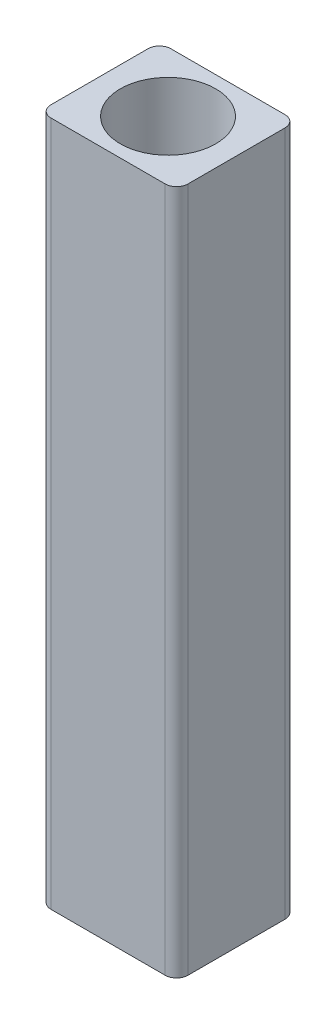
ISO-10303-21;
HEADER;
FILE_DESCRIPTION(('STEP AP214'),'2;1');
FILE_NAME('part.step','',(''),(''),'','','');
FILE_SCHEMA(('AUTOMOTIVE_DESIGN { 1 0 10303 214 1 1 1 1 }'));
ENDSEC;
DATA;
#1=APPLICATION_CONTEXT('core data for automotive mechanical design processes');
#2=APPLICATION_PROTOCOL_DEFINITION('international standard','automotive_design',2000,#1);
#3=PRODUCT_CONTEXT('',#1,'mechanical');
#4=PRODUCT('Part','Part','',(#3));
#5=PRODUCT_RELATED_PRODUCT_CATEGORY('part','',(#4));
#6=PRODUCT_DEFINITION_FORMATION('','',#4);
#7=PRODUCT_DEFINITION_CONTEXT('part definition',#1,'design');
#8=PRODUCT_DEFINITION('design','',#6,#7);
#9=PRODUCT_DEFINITION_SHAPE('','',#8);
#10=(LENGTH_UNIT() NAMED_UNIT(*) SI_UNIT(.MILLI.,.METRE.));
#11=(NAMED_UNIT(*) PLANE_ANGLE_UNIT() SI_UNIT($,.RADIAN.));
#12=(NAMED_UNIT(*) SI_UNIT($,.STERADIAN.) SOLID_ANGLE_UNIT());
#13=UNCERTAINTY_MEASURE_WITH_UNIT(LENGTH_MEASURE(1.E-05),#10,'distance_accuracy_value','');
#14=(GEOMETRIC_REPRESENTATION_CONTEXT(3) GLOBAL_UNCERTAINTY_ASSIGNED_CONTEXT((#13)) GLOBAL_UNIT_ASSIGNED_CONTEXT((#10,
#11,#12)) REPRESENTATION_CONTEXT('',''));
#15=CARTESIAN_POINT('',(0.,0.,0.));
#16=DIRECTION('',(0.,0.,1.));
#17=DIRECTION('',(1.,0.,0.));
#18=AXIS2_PLACEMENT_3D('',#15,#16,#17);
#19=CARTESIAN_POINT('',(0.,30.48,0.));
#20=DIRECTION('',(0.,-1.,0.));
#21=DIRECTION('',(0.,0.,-1.));
#22=AXIS2_PLACEMENT_3D('',#19,#20,#21);
#23=PLANE('',#22);
#24=DIRECTION('',(-1.,0.,0.));
#25=VECTOR('',#24,1.);
#26=CARTESIAN_POINT('',(-3.048,30.48,-2.667));
#27=LINE('',#26,#25);
#28=CARTESIAN_POINT('',(2.54,30.48,-2.667));
#29=VERTEX_POINT('',#28);
#30=CARTESIAN_POINT('',(-2.54,30.48,-2.667));
#31=VERTEX_POINT('',#30);
#32=EDGE_CURVE('E189',#29,#31,#27,.T.);
#33=ORIENTED_EDGE('',*,*,#32,.T.);
#34=CARTESIAN_POINT('',(-2.54,30.48,-2.159));
#35=DIRECTION('',(0.,-1.,0.));
#36=DIRECTION('',(0.,0.,-1.));
#37=AXIS2_PLACEMENT_3D('',#34,#35,#36);
#38=CIRCLE('',#37,0.508);
#39=CARTESIAN_POINT('',(-3.048,30.48,-2.159));
#40=VERTEX_POINT('',#39);
#41=EDGE_CURVE('E175',#31,#40,#38,.F.);
#42=ORIENTED_EDGE('',*,*,#41,.T.);
#43=DIRECTION('',(0.,0.,1.));
#44=VECTOR('',#43,1.);
#45=CARTESIAN_POINT('',(-3.048,30.48,2.667));
#46=LINE('',#45,#44);
#47=CARTESIAN_POINT('',(-3.048,30.48,2.159));
#48=VERTEX_POINT('',#47);
#49=EDGE_CURVE('E132',#40,#48,#46,.T.);
#50=ORIENTED_EDGE('',*,*,#49,.T.);
#51=CARTESIAN_POINT('',(-2.54,30.48,2.159));
#52=DIRECTION('',(0.,-1.,0.));
#53=DIRECTION('',(0.,0.,-1.));
#54=AXIS2_PLACEMENT_3D('',#51,#52,#53);
#55=CIRCLE('',#54,0.508);
#56=CARTESIAN_POINT('',(-2.54,30.48,2.667));
#57=VERTEX_POINT('',#56);
#58=EDGE_CURVE('E67',#48,#57,#55,.F.);
#59=ORIENTED_EDGE('',*,*,#58,.T.);
#60=DIRECTION('',(1.,0.,0.));
#61=VECTOR('',#60,1.);
#62=CARTESIAN_POINT('',(-3.048,30.48,2.667));
#63=LINE('',#62,#61);
#64=CARTESIAN_POINT('',(2.54,30.48,2.667));
#65=VERTEX_POINT('',#64);
#66=EDGE_CURVE('E154',#57,#65,#63,.T.);
#67=ORIENTED_EDGE('',*,*,#66,.T.);
#68=CARTESIAN_POINT('',(2.54,30.48,2.159));
#69=DIRECTION('',(0.,-1.,0.));
#70=DIRECTION('',(0.,0.,-1.));
#71=AXIS2_PLACEMENT_3D('',#68,#69,#70);
#72=CIRCLE('',#71,0.508);
#73=CARTESIAN_POINT('',(3.048,30.48,2.159));
#74=VERTEX_POINT('',#73);
#75=EDGE_CURVE('E167',#65,#74,#72,.F.);
#76=ORIENTED_EDGE('',*,*,#75,.T.);
#77=DIRECTION('',(0.,0.,-1.));
#78=VECTOR('',#77,1.);
#79=CARTESIAN_POINT('',(3.048,30.48,2.667));
#80=LINE('',#79,#78);
#81=CARTESIAN_POINT('',(3.048,30.48,-2.159));
#82=VERTEX_POINT('',#81);
#83=EDGE_CURVE('E147',#74,#82,#80,.T.);
#84=ORIENTED_EDGE('',*,*,#83,.T.);
#85=CARTESIAN_POINT('',(2.54,30.48,-2.159));
#86=DIRECTION('',(0.,-1.,0.));
#87=DIRECTION('',(0.,0.,-1.));
#88=AXIS2_PLACEMENT_3D('',#85,#86,#87);
#89=CIRCLE('',#88,0.508);
#90=EDGE_CURVE('E172',#82,#29,#89,.F.);
#91=ORIENTED_EDGE('',*,*,#90,.T.);
#92=EDGE_LOOP('',(#33,#42,#50,#59,#67,#76,#84,#91));
#93=FACE_BOUND('',#92,.T.);
#94=CARTESIAN_POINT('',(0.,30.48,0.));
#95=DIRECTION('',(0.,1.,0.));
#96=DIRECTION('',(0.,0.,1.));
#97=AXIS2_PLACEMENT_3D('',#94,#95,#96);
#98=CIRCLE('',#97,2.122);
#99=CARTESIAN_POINT('',(0.,30.48,-2.122));
#100=VERTEX_POINT('',#99);
#101=EDGE_CURVE('E203',#100,#100,#98,.T.);
#102=ORIENTED_EDGE('',*,*,#101,.F.);
#103=EDGE_LOOP('',(#102));
#104=FACE_BOUND('',#103,.T.);
#105=ADVANCED_FACE('F45',(#93,#104),#23,.F.);
#106=CARTESIAN_POINT('',(0.,0.,0.));
#107=DIRECTION('',(0.,-1.,0.));
#108=DIRECTION('',(0.,0.,-1.));
#109=AXIS2_PLACEMENT_3D('',#106,#107,#108);
#110=PLANE('',#109);
#111=DIRECTION('',(0.,0.,1.));
#112=VECTOR('',#111,1.);
#113=CARTESIAN_POINT('',(-3.048,0.,2.667));
#114=LINE('',#113,#112);
#115=CARTESIAN_POINT('',(-3.048,0.,-2.159));
#116=VERTEX_POINT('',#115);
#117=CARTESIAN_POINT('',(-3.048,0.,2.159));
#118=VERTEX_POINT('',#117);
#119=EDGE_CURVE('E130',#116,#118,#114,.T.);
#120=ORIENTED_EDGE('',*,*,#119,.F.);
#121=CARTESIAN_POINT('',(-2.54,0.,-2.159));
#122=DIRECTION('',(0.,-1.,0.));
#123=DIRECTION('',(0.,0.,-1.));
#124=AXIS2_PLACEMENT_3D('',#121,#122,#123);
#125=CIRCLE('',#124,0.508);
#126=CARTESIAN_POINT('',(-2.54,0.,-2.667));
#127=VERTEX_POINT('',#126);
#128=EDGE_CURVE('E112',#116,#127,#125,.T.);
#129=ORIENTED_EDGE('',*,*,#128,.T.);
#130=DIRECTION('',(-1.,0.,0.));
#131=VECTOR('',#130,1.);
#132=CARTESIAN_POINT('',(-3.048,0.,-2.667));
#133=LINE('',#132,#131);
#134=CARTESIAN_POINT('',(2.54,0.,-2.667));
#135=VERTEX_POINT('',#134);
#136=EDGE_CURVE('E143',#135,#127,#133,.T.);
#137=ORIENTED_EDGE('',*,*,#136,.F.);
#138=CARTESIAN_POINT('',(2.54,0.,-2.159));
#139=DIRECTION('',(0.,-1.,0.));
#140=DIRECTION('',(0.,0.,-1.));
#141=AXIS2_PLACEMENT_3D('',#138,#139,#140);
#142=CIRCLE('',#141,0.508);
#143=CARTESIAN_POINT('',(3.048,0.,-2.159));
#144=VERTEX_POINT('',#143);
#145=EDGE_CURVE('E124',#135,#144,#142,.T.);
#146=ORIENTED_EDGE('',*,*,#145,.T.);
#147=DIRECTION('',(0.,0.,-1.));
#148=VECTOR('',#147,1.);
#149=CARTESIAN_POINT('',(3.048,0.,2.667));
#150=LINE('',#149,#148);
#151=CARTESIAN_POINT('',(3.048,0.,2.159));
#152=VERTEX_POINT('',#151);
#153=EDGE_CURVE('E149',#152,#144,#150,.T.);
#154=ORIENTED_EDGE('',*,*,#153,.F.);
#155=CARTESIAN_POINT('',(2.54,0.,2.159));
#156=DIRECTION('',(0.,-1.,0.));
#157=DIRECTION('',(0.,0.,-1.));
#158=AXIS2_PLACEMENT_3D('',#155,#156,#157);
#159=CIRCLE('',#158,0.508);
#160=CARTESIAN_POINT('',(2.54,0.,2.667));
#161=VERTEX_POINT('',#160);
#162=EDGE_CURVE('E134',#152,#161,#159,.T.);
#163=ORIENTED_EDGE('',*,*,#162,.T.);
#164=DIRECTION('',(1.,0.,0.));
#165=VECTOR('',#164,1.);
#166=CARTESIAN_POINT('',(-3.048,0.,2.667));
#167=LINE('',#166,#165);
#168=CARTESIAN_POINT('',(-2.54,0.,2.667));
#169=VERTEX_POINT('',#168);
#170=EDGE_CURVE('E142',#169,#161,#167,.T.);
#171=ORIENTED_EDGE('',*,*,#170,.F.);
#172=CARTESIAN_POINT('',(-2.54,0.,2.159));
#173=DIRECTION('',(0.,-1.,0.));
#174=DIRECTION('',(0.,0.,-1.));
#175=AXIS2_PLACEMENT_3D('',#172,#173,#174);
#176=CIRCLE('',#175,0.508);
#177=EDGE_CURVE('E140',#169,#118,#176,.T.);
#178=ORIENTED_EDGE('',*,*,#177,.T.);
#179=EDGE_LOOP('',(#120,#129,#137,#146,#154,#163,#171,#178));
#180=FACE_BOUND('',#179,.T.);
#181=CARTESIAN_POINT('',(0.,0.,0.));
#182=DIRECTION('',(0.,1.,0.));
#183=DIRECTION('',(0.,0.,1.));
#184=AXIS2_PLACEMENT_3D('',#181,#182,#183);
#185=CIRCLE('',#184,2.122);
#186=CARTESIAN_POINT('',(0.,0.,-2.122));
#187=VERTEX_POINT('',#186);
#188=EDGE_CURVE('E199',#187,#187,#185,.T.);
#189=ORIENTED_EDGE('',*,*,#188,.T.);
#190=EDGE_LOOP('',(#189));
#191=FACE_BOUND('',#190,.T.);
#192=ADVANCED_FACE('F137',(#180,#191),#110,.T.);
#193=CARTESIAN_POINT('',(3.048,30.48,2.667));
#194=DIRECTION('',(-1.,0.,0.));
#195=DIRECTION('',(0.,0.,1.));
#196=AXIS2_PLACEMENT_3D('',#193,#194,#195);
#197=PLANE('',#196);
#198=ORIENTED_EDGE('',*,*,#153,.T.);
#199=DIRECTION('',(0.,-1.,0.));
#200=VECTOR('',#199,1.);
#201=CARTESIAN_POINT('',(3.048,30.48,-2.159));
#202=LINE('',#201,#200);
#203=EDGE_CURVE('E182',#144,#82,#202,.F.);
#204=ORIENTED_EDGE('',*,*,#203,.T.);
#205=ORIENTED_EDGE('',*,*,#83,.F.);
#206=DIRECTION('',(0.,-1.,0.));
#207=VECTOR('',#206,1.);
#208=CARTESIAN_POINT('',(3.048,30.48,2.159));
#209=LINE('',#208,#207);
#210=EDGE_CURVE('E178',#74,#152,#209,.T.);
#211=ORIENTED_EDGE('',*,*,#210,.T.);
#212=EDGE_LOOP('',(#198,#204,#205,#211));
#213=FACE_BOUND('',#212,.T.);
#214=ADVANCED_FACE('F231',(#213),#197,.F.);
#215=CARTESIAN_POINT('',(-3.048,30.48,-2.667));
#216=DIRECTION('',(0.,0.,1.));
#217=DIRECTION('',(1.,0.,0.));
#218=AXIS2_PLACEMENT_3D('',#215,#216,#217);
#219=PLANE('',#218);
#220=ORIENTED_EDGE('',*,*,#136,.T.);
#221=DIRECTION('',(0.,-1.,0.));
#222=VECTOR('',#221,1.);
#223=CARTESIAN_POINT('',(-2.54,30.48,-2.667));
#224=LINE('',#223,#222);
#225=EDGE_CURVE('E117',#127,#31,#224,.F.);
#226=ORIENTED_EDGE('',*,*,#225,.T.);
#227=ORIENTED_EDGE('',*,*,#32,.F.);
#228=DIRECTION('',(0.,-1.,0.));
#229=VECTOR('',#228,1.);
#230=CARTESIAN_POINT('',(2.54,30.48,-2.667));
#231=LINE('',#230,#229);
#232=EDGE_CURVE('E123',#29,#135,#231,.T.);
#233=ORIENTED_EDGE('',*,*,#232,.T.);
#234=EDGE_LOOP('',(#220,#226,#227,#233));
#235=FACE_BOUND('',#234,.T.);
#236=ADVANCED_FACE('F237',(#235),#219,.F.);
#237=CARTESIAN_POINT('',(-3.048,30.48,2.667));
#238=DIRECTION('',(1.,0.,0.));
#239=DIRECTION('',(0.,0.,-1.));
#240=AXIS2_PLACEMENT_3D('',#237,#238,#239);
#241=PLANE('',#240);
#242=ORIENTED_EDGE('',*,*,#49,.F.);
#243=DIRECTION('',(0.,-1.,0.));
#244=VECTOR('',#243,1.);
#245=CARTESIAN_POINT('',(-3.048,30.48,-2.159));
#246=LINE('',#245,#244);
#247=EDGE_CURVE('E116',#40,#116,#246,.T.);
#248=ORIENTED_EDGE('',*,*,#247,.T.);
#249=ORIENTED_EDGE('',*,*,#119,.T.);
#250=DIRECTION('',(0.,-1.,0.));
#251=VECTOR('',#250,1.);
#252=CARTESIAN_POINT('',(-3.048,30.48,2.159));
#253=LINE('',#252,#251);
#254=EDGE_CURVE('E135',#118,#48,#253,.F.);
#255=ORIENTED_EDGE('',*,*,#254,.T.);
#256=EDGE_LOOP('',(#242,#248,#249,#255));
#257=FACE_BOUND('',#256,.T.);
#258=ADVANCED_FACE('F129',(#257),#241,.F.);
#259=CARTESIAN_POINT('',(-3.048,30.48,2.667));
#260=DIRECTION('',(0.,0.,-1.));
#261=DIRECTION('',(-1.,0.,0.));
#262=AXIS2_PLACEMENT_3D('',#259,#260,#261);
#263=PLANE('',#262);
#264=ORIENTED_EDGE('',*,*,#66,.F.);
#265=DIRECTION('',(0.,-1.,0.));
#266=VECTOR('',#265,1.);
#267=CARTESIAN_POINT('',(-2.54,30.48,2.667));
#268=LINE('',#267,#266);
#269=EDGE_CURVE('E11',#57,#169,#268,.T.);
#270=ORIENTED_EDGE('',*,*,#269,.T.);
#271=ORIENTED_EDGE('',*,*,#170,.T.);
#272=DIRECTION('',(0.,-1.,0.));
#273=VECTOR('',#272,1.);
#274=CARTESIAN_POINT('',(2.54,30.48,2.667));
#275=LINE('',#274,#273);
#276=EDGE_CURVE('E54',#161,#65,#275,.F.);
#277=ORIENTED_EDGE('',*,*,#276,.T.);
#278=EDGE_LOOP('',(#264,#270,#271,#277));
#279=FACE_BOUND('',#278,.T.);
#280=ADVANCED_FACE('F217',(#279),#263,.F.);
#281=CARTESIAN_POINT('',(0.,30.48,0.));
#282=DIRECTION('',(0.,-1.,0.));
#283=DIRECTION('',(0.,0.,-1.));
#284=AXIS2_PLACEMENT_3D('',#281,#282,#283);
#285=CYLINDRICAL_SURFACE('',#284,2.122);
#286=CARTESIAN_POINT('',(0.,30.48,-2.122));
#287=CARTESIAN_POINT('',(0.,30.1625,-2.122));
#288=CARTESIAN_POINT('',(0.,29.845,-2.122));
#289=CARTESIAN_POINT('',(0.,29.21,-2.122));
#290=CARTESIAN_POINT('',(0.,28.8925,-2.122));
#291=CARTESIAN_POINT('',(0.,28.2575,-2.122));
#292=CARTESIAN_POINT('',(0.,27.94,-2.122));
#293=CARTESIAN_POINT('',(0.,27.305,-2.122));
#294=CARTESIAN_POINT('',(0.,26.9875,-2.122));
#295=CARTESIAN_POINT('',(0.,26.3525,-2.122));
#296=CARTESIAN_POINT('',(0.,26.035,-2.122));
#297=CARTESIAN_POINT('',(0.,25.4,-2.122));
#298=CARTESIAN_POINT('',(0.,25.0825,-2.122));
#299=CARTESIAN_POINT('',(0.,24.4475,-2.122));
#300=CARTESIAN_POINT('',(0.,24.13,-2.122));
#301=CARTESIAN_POINT('',(0.,23.495,-2.122));
#302=CARTESIAN_POINT('',(0.,23.1775,-2.122));
#303=CARTESIAN_POINT('',(0.,22.5425,-2.122));
#304=CARTESIAN_POINT('',(0.,22.225,-2.122));
#305=CARTESIAN_POINT('',(0.,21.59,-2.122));
#306=CARTESIAN_POINT('',(0.,21.2725,-2.122));
#307=CARTESIAN_POINT('',(0.,20.6375,-2.122));
#308=CARTESIAN_POINT('',(0.,20.32,-2.122));
#309=CARTESIAN_POINT('',(0.,19.685,-2.122));
#310=CARTESIAN_POINT('',(0.,19.3675,-2.122));
#311=CARTESIAN_POINT('',(0.,18.7325,-2.122));
#312=CARTESIAN_POINT('',(0.,18.415,-2.122));
#313=CARTESIAN_POINT('',(0.,17.78,-2.122));
#314=CARTESIAN_POINT('',(0.,17.4625,-2.122));
#315=CARTESIAN_POINT('',(0.,16.8275,-2.122));
#316=CARTESIAN_POINT('',(0.,16.51,-2.122));
#317=CARTESIAN_POINT('',(0.,15.875,-2.122));
#318=CARTESIAN_POINT('',(0.,15.5575,-2.122));
#319=CARTESIAN_POINT('',(0.,14.9225,-2.122));
#320=CARTESIAN_POINT('',(0.,14.605,-2.122));
#321=CARTESIAN_POINT('',(0.,13.97,-2.122));
#322=CARTESIAN_POINT('',(0.,13.6525,-2.122));
#323=CARTESIAN_POINT('',(0.,13.0175,-2.122));
#324=CARTESIAN_POINT('',(0.,12.7,-2.122));
#325=CARTESIAN_POINT('',(0.,12.065,-2.122));
#326=CARTESIAN_POINT('',(0.,11.7475,-2.122));
#327=CARTESIAN_POINT('',(0.,11.1125,-2.122));
#328=CARTESIAN_POINT('',(0.,10.795,-2.122));
#329=CARTESIAN_POINT('',(0.,10.16,-2.122));
#330=CARTESIAN_POINT('',(0.,9.8425,-2.122));
#331=CARTESIAN_POINT('',(0.,9.2075,-2.122));
#332=CARTESIAN_POINT('',(0.,8.89,-2.122));
#333=CARTESIAN_POINT('',(0.,8.255,-2.122));
#334=CARTESIAN_POINT('',(0.,7.9375,-2.122));
#335=CARTESIAN_POINT('',(0.,7.3025,-2.122));
#336=CARTESIAN_POINT('',(0.,6.985,-2.122));
#337=CARTESIAN_POINT('',(0.,6.35,-2.122));
#338=CARTESIAN_POINT('',(0.,6.0325,-2.122));
#339=CARTESIAN_POINT('',(0.,5.3975,-2.122));
#340=CARTESIAN_POINT('',(0.,5.08,-2.122));
#341=CARTESIAN_POINT('',(0.,4.445,-2.122));
#342=CARTESIAN_POINT('',(0.,4.1275,-2.122));
#343=CARTESIAN_POINT('',(0.,3.4925,-2.122));
#344=CARTESIAN_POINT('',(0.,3.175,-2.122));
#345=CARTESIAN_POINT('',(0.,2.54,-2.122));
#346=CARTESIAN_POINT('',(0.,2.2225,-2.122));
#347=CARTESIAN_POINT('',(0.,1.5875,-2.122));
#348=CARTESIAN_POINT('',(0.,1.27,-2.122));
#349=CARTESIAN_POINT('',(0.,0.634999999999999,-2.122));
#350=CARTESIAN_POINT('',(0.,0.3175,-2.122));
#351=CARTESIAN_POINT('',(0.,0.,-2.122));
#352=B_SPLINE_CURVE_WITH_KNOTS('',3,(#286,#287,#288,#289,#290,#291,#292,#293,#294,#295,#296,
#297,#298,#299,#300,#301,#302,#303,#304,#305,#306,#307,#308,#309,#310,#311,#312,#313,#314,#315,
#316,#317,#318,#319,#320,#321,#322,#323,#324,#325,#326,#327,#328,#329,#330,#331,#332,#333,#334,
#335,#336,#337,#338,#339,#340,#341,#342,#343,#344,#345,#346,#347,#348,#349,#350,#351),
.UNSPECIFIED.,.F.,.F.,(4,2,2,2,2,2,2,2,2,2,2,2,2,2,2,2,2,2,2,2,2,2,2,2,2,2,2,2,2,2,2,2,4),(0.,
0.952500000000002,1.905,2.8575,3.81,4.7625,5.715,6.6675,7.62,8.5725,9.525,10.4775,11.43,12.3825,
13.335,14.2875,15.24,16.1925,17.145,18.0975,19.05,20.0025,20.955,21.9075,22.86,23.8125,24.765,
25.7175,26.67,27.6225,28.575,29.5275,30.48),.UNSPECIFIED.);
#353=EDGE_CURVE('BSEAM215',#100,#187,#352,.T.);
#354=ORIENTED_EDGE('',*,*,#101,.T.);
#355=ORIENTED_EDGE('',*,*,#188,.F.);
#356=ORIENTED_EDGE('',*,*,#353,.T.);
#357=ORIENTED_EDGE('',*,*,#353,.F.);
#358=EDGE_LOOP('',(#354,#356,#355,#357));
#359=FACE_BOUND('',#358,.T.);
#360=ADVANCED_FACE('F215',(#359),#285,.F.);
#361=CARTESIAN_POINT('',(-2.54,30.48,-2.159));
#362=DIRECTION('',(0.,-1.,0.));
#363=DIRECTION('',(0.,0.,-1.));
#364=AXIS2_PLACEMENT_3D('',#361,#362,#363);
#365=CYLINDRICAL_SURFACE('',#364,0.508);
#366=ORIENTED_EDGE('',*,*,#41,.F.);
#367=ORIENTED_EDGE('',*,*,#225,.F.);
#368=ORIENTED_EDGE('',*,*,#128,.F.);
#369=ORIENTED_EDGE('',*,*,#247,.F.);
#370=EDGE_LOOP('',(#366,#367,#368,#369));
#371=FACE_BOUND('',#370,.T.);
#372=ADVANCED_FACE('F115',(#371),#365,.T.);
#373=CARTESIAN_POINT('',(2.54,30.48,-2.159));
#374=DIRECTION('',(0.,-1.,0.));
#375=DIRECTION('',(0.,0.,-1.));
#376=AXIS2_PLACEMENT_3D('',#373,#374,#375);
#377=CYLINDRICAL_SURFACE('',#376,0.508);
#378=ORIENTED_EDGE('',*,*,#90,.F.);
#379=ORIENTED_EDGE('',*,*,#203,.F.);
#380=ORIENTED_EDGE('',*,*,#145,.F.);
#381=ORIENTED_EDGE('',*,*,#232,.F.);
#382=EDGE_LOOP('',(#378,#379,#380,#381));
#383=FACE_BOUND('',#382,.T.);
#384=ADVANCED_FACE('F223',(#383),#377,.T.);
#385=CARTESIAN_POINT('',(-2.54,30.48,2.159));
#386=DIRECTION('',(0.,-1.,0.));
#387=DIRECTION('',(0.,0.,-1.));
#388=AXIS2_PLACEMENT_3D('',#385,#386,#387);
#389=CYLINDRICAL_SURFACE('',#388,0.508);
#390=ORIENTED_EDGE('',*,*,#58,.F.);
#391=ORIENTED_EDGE('',*,*,#254,.F.);
#392=ORIENTED_EDGE('',*,*,#177,.F.);
#393=ORIENTED_EDGE('',*,*,#269,.F.);
#394=EDGE_LOOP('',(#390,#391,#392,#393));
#395=FACE_BOUND('',#394,.T.);
#396=ADVANCED_FACE('F244',(#395),#389,.T.);
#397=CARTESIAN_POINT('',(2.54,30.48,2.159));
#398=DIRECTION('',(0.,-1.,0.));
#399=DIRECTION('',(0.,0.,-1.));
#400=AXIS2_PLACEMENT_3D('',#397,#398,#399);
#401=CYLINDRICAL_SURFACE('',#400,0.508);
#402=ORIENTED_EDGE('',*,*,#75,.F.);
#403=ORIENTED_EDGE('',*,*,#276,.F.);
#404=ORIENTED_EDGE('',*,*,#162,.F.);
#405=ORIENTED_EDGE('',*,*,#210,.F.);
#406=EDGE_LOOP('',(#402,#403,#404,#405));
#407=FACE_BOUND('',#406,.T.);
#408=ADVANCED_FACE('F47',(#407),#401,.T.);
#409=CLOSED_SHELL('',(#105,#192,#214,#236,#258,#280,#360,#372,#384,#396,#408));
#410=MANIFOLD_SOLID_BREP('B2',#409);
#411=ADVANCED_BREP_SHAPE_REPRESENTATION('',(#18,#410),#14);
#412=SHAPE_DEFINITION_REPRESENTATION(#9,#411);
ENDSEC;
END-ISO-10303-21;
